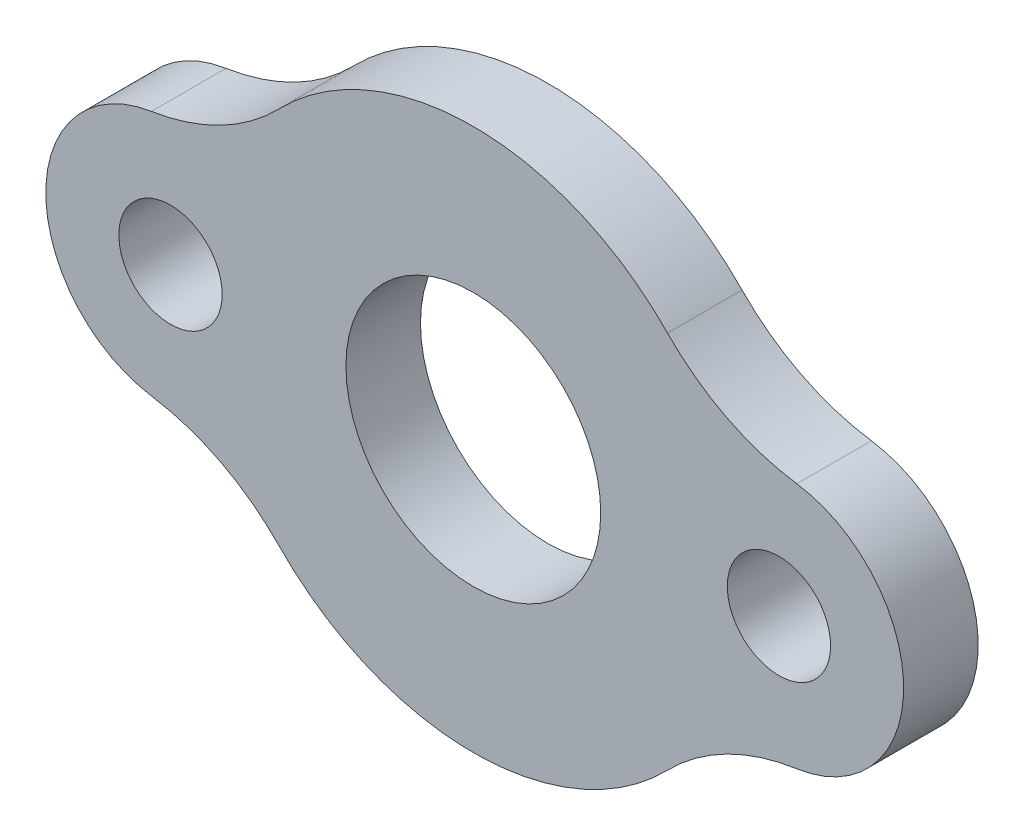
ISO-10303-21;
HEADER;
FILE_DESCRIPTION(('STEP AP214'),'2;1');
FILE_NAME('part.step','',(''),(''),'','','');
FILE_SCHEMA(('AUTOMOTIVE_DESIGN { 1 0 10303 214 1 1 1 1 }'));
ENDSEC;
DATA;
#1=APPLICATION_CONTEXT('core data for automotive mechanical design processes');
#2=APPLICATION_PROTOCOL_DEFINITION('international standard','automotive_design',2000,#1);
#3=PRODUCT_CONTEXT('',#1,'mechanical');
#4=PRODUCT('Part','Part','',(#3));
#5=PRODUCT_RELATED_PRODUCT_CATEGORY('part','',(#4));
#6=PRODUCT_DEFINITION_FORMATION('','',#4);
#7=PRODUCT_DEFINITION_CONTEXT('part definition',#1,'design');
#8=PRODUCT_DEFINITION('design','',#6,#7);
#9=PRODUCT_DEFINITION_SHAPE('','',#8);
#10=(LENGTH_UNIT() NAMED_UNIT(*) SI_UNIT(.MILLI.,.METRE.));
#11=(NAMED_UNIT(*) PLANE_ANGLE_UNIT() SI_UNIT($,.RADIAN.));
#12=(NAMED_UNIT(*) SI_UNIT($,.STERADIAN.) SOLID_ANGLE_UNIT());
#13=UNCERTAINTY_MEASURE_WITH_UNIT(LENGTH_MEASURE(1.E-05),#10,'distance_accuracy_value','');
#14=(GEOMETRIC_REPRESENTATION_CONTEXT(3) GLOBAL_UNCERTAINTY_ASSIGNED_CONTEXT((#13)) GLOBAL_UNIT_ASSIGNED_CONTEXT((#10,
#11,#12)) REPRESENTATION_CONTEXT('',''));
#15=CARTESIAN_POINT('',(0.,0.,0.));
#16=DIRECTION('',(0.,0.,1.));
#17=DIRECTION('',(1.,0.,0.));
#18=AXIS2_PLACEMENT_3D('',#15,#16,#17);
#19=CARTESIAN_POINT('',(3.93831321020069,-3.8392303330352,1.65));
#20=DIRECTION('',(0.,0.,1.));
#21=DIRECTION('',(1.,0.,0.));
#22=AXIS2_PLACEMENT_3D('',#19,#20,#21);
#23=PLANE('',#22);
#24=CARTESIAN_POINT('',(-6.69999985024333,0.,1.65));
#25=DIRECTION('',(0.,0.,1.));
#26=DIRECTION('',(1.,0.,0.));
#27=AXIS2_PLACEMENT_3D('',#24,#25,#26);
#28=CIRCLE('',#27,1.14300000000002);
#29=CARTESIAN_POINT('',(-5.55699985024331,0.,1.65));
#30=VERTEX_POINT('',#29);
#31=EDGE_CURVE('E186',#30,#30,#28,.T.);
#32=ORIENTED_EDGE('',*,*,#31,.F.);
#33=EDGE_LOOP('',(#32));
#34=FACE_BOUND('',#33,.T.);
#35=CARTESIAN_POINT('',(0.,0.,1.65));
#36=DIRECTION('',(0.,0.,1.));
#37=DIRECTION('',(1.,0.,0.));
#38=AXIS2_PLACEMENT_3D('',#35,#36,#37);
#39=CIRCLE('',#38,6.00000008940699);
#40=CARTESIAN_POINT('',(-4.30212440640869,-4.18231116306121,1.65));
#41=VERTEX_POINT('',#40);
#42=CARTESIAN_POINT('',(4.29634171295548,-4.18825130077008,1.65));
#43=VERTEX_POINT('',#42);
#44=EDGE_CURVE('E51',#41,#43,#39,.T.);
#45=ORIENTED_EDGE('',*,*,#44,.T.);
#46=CARTESIAN_POINT('',(7.87662642040138,-7.67846066607039,1.65));
#47=DIRECTION('',(0.,0.,-1.));
#48=DIRECTION('',(1.,0.,0.));
#49=AXIS2_PLACEMENT_3D('',#46,#47,#48);
#50=CIRCLE('',#49,5.00000000000009);
#51=CARTESIAN_POINT('',(7.1583412740768,-2.73032299129108,1.65));
#52=VERTEX_POINT('',#51);
#53=EDGE_CURVE('E180',#43,#52,#50,.T.);
#54=ORIENTED_EDGE('',*,*,#53,.T.);
#55=CARTESIAN_POINT('',(6.76200014975667,0.,1.65));
#56=DIRECTION('',(0.,0.,1.));
#57=DIRECTION('',(1.,0.,0.));
#58=AXIS2_PLACEMENT_3D('',#55,#56,#57);
#59=CIRCLE('',#58,2.75894000000001);
#60=CARTESIAN_POINT('',(7.1583412740768,2.73032299129108,1.65));
#61=VERTEX_POINT('',#60);
#62=EDGE_CURVE('E161',#52,#61,#59,.T.);
#63=ORIENTED_EDGE('',*,*,#62,.T.);
#64=CARTESIAN_POINT('',(7.87662642040138,7.67846066607039,1.65));
#65=DIRECTION('',(0.,0.,-1.));
#66=DIRECTION('',(1.,0.,0.));
#67=AXIS2_PLACEMENT_3D('',#64,#65,#66);
#68=CIRCLE('',#67,5.00000000000009);
#69=CARTESIAN_POINT('',(4.29634171295549,4.18825130077009,1.65));
#70=VERTEX_POINT('',#69);
#71=EDGE_CURVE('E176',#61,#70,#68,.T.);
#72=ORIENTED_EDGE('',*,*,#71,.T.);
#73=CARTESIAN_POINT('',(0.,0.,1.65));
#74=DIRECTION('',(0.,0.,1.));
#75=DIRECTION('',(1.,0.,0.));
#76=AXIS2_PLACEMENT_3D('',#73,#74,#75);
#77=CIRCLE('',#76,6.00000008940697);
#78=CARTESIAN_POINT('',(-4.30212440640868,4.1823111630612,1.65));
#79=VERTEX_POINT('',#78);
#80=EDGE_CURVE('E111',#70,#79,#77,.T.);
#81=ORIENTED_EDGE('',*,*,#80,.T.);
#82=CARTESIAN_POINT('',(-7.88722802499375,7.66757041367788,1.65));
#83=DIRECTION('',(0.,0.,-1.));
#84=DIRECTION('',(1.,0.,0.));
#85=AXIS2_PLACEMENT_3D('',#82,#83,#84);
#86=CIRCLE('',#85,5.0000000000001);
#87=CARTESIAN_POINT('',(-7.12215689048781,2.72645048403169,1.65));
#88=VERTEX_POINT('',#87);
#89=EDGE_CURVE('E105',#79,#88,#86,.T.);
#90=ORIENTED_EDGE('',*,*,#89,.T.);
#91=CARTESIAN_POINT('',(-6.69999985024333,0.,1.65));
#92=DIRECTION('',(0.,0.,1.));
#93=DIRECTION('',(1.,0.,0.));
#94=AXIS2_PLACEMENT_3D('',#91,#92,#93);
#95=CIRCLE('',#94,2.75893979791235);
#96=CARTESIAN_POINT('',(-7.12215689048781,-2.72645048403168,1.65));
#97=VERTEX_POINT('',#96);
#98=EDGE_CURVE('E109',#88,#97,#95,.T.);
#99=ORIENTED_EDGE('',*,*,#98,.T.);
#100=CARTESIAN_POINT('',(-7.88722802499378,-7.66757041367785,1.65));
#101=DIRECTION('',(0.,0.,-1.));
#102=DIRECTION('',(1.,0.,0.));
#103=AXIS2_PLACEMENT_3D('',#100,#101,#102);
#104=CIRCLE('',#103,5.00000000000009);
#105=EDGE_CURVE('E125',#97,#41,#104,.T.);
#106=ORIENTED_EDGE('',*,*,#105,.T.);
#107=EDGE_LOOP('',(#45,#54,#63,#72,#81,#90,#99,#106));
#108=FACE_BOUND('',#107,.T.);
#109=CARTESIAN_POINT('',(6.76200014975667,0.,1.65));
#110=DIRECTION('',(0.,0.,1.));
#111=DIRECTION('',(1.,0.,0.));
#112=AXIS2_PLACEMENT_3D('',#109,#110,#111);
#113=CIRCLE('',#112,1.14300000000002);
#114=CARTESIAN_POINT('',(7.90500014975669,0.,1.65));
#115=VERTEX_POINT('',#114);
#116=EDGE_CURVE('E134',#115,#115,#113,.T.);
#117=ORIENTED_EDGE('',*,*,#116,.F.);
#118=EDGE_LOOP('',(#117));
#119=FACE_BOUND('',#118,.T.);
#120=CARTESIAN_POINT('',(0.,0.,1.65));
#121=DIRECTION('',(0.,0.,1.));
#122=DIRECTION('',(1.,0.,0.));
#123=AXIS2_PLACEMENT_3D('',#120,#121,#122);
#124=CIRCLE('',#123,2.81921174677323);
#125=CARTESIAN_POINT('',(2.81921174677323,0.,1.65));
#126=VERTEX_POINT('',#125);
#127=EDGE_CURVE('E192',#126,#126,#124,.T.);
#128=ORIENTED_EDGE('',*,*,#127,.F.);
#129=EDGE_LOOP('',(#128));
#130=FACE_BOUND('',#129,.T.);
#131=ADVANCED_FACE('F34',(#34,#108,#119,#130),#23,.T.);
#132=CARTESIAN_POINT('',(3.93831321020069,-3.8392303330352,0.));
#133=DIRECTION('',(0.,0.,1.));
#134=DIRECTION('',(1.,0.,0.));
#135=AXIS2_PLACEMENT_3D('',#132,#133,#134);
#136=PLANE('',#135);
#137=CARTESIAN_POINT('',(-6.69999985024333,0.,0.));
#138=DIRECTION('',(0.,0.,1.));
#139=DIRECTION('',(1.,0.,0.));
#140=AXIS2_PLACEMENT_3D('',#137,#138,#139);
#141=CIRCLE('',#140,1.14300000000002);
#142=CARTESIAN_POINT('',(-5.55699985024331,0.,0.));
#143=VERTEX_POINT('',#142);
#144=EDGE_CURVE('E189',#143,#143,#141,.T.);
#145=ORIENTED_EDGE('',*,*,#144,.T.);
#146=EDGE_LOOP('',(#145));
#147=FACE_BOUND('',#146,.T.);
#148=CARTESIAN_POINT('',(7.87662642040138,-7.67846066607039,0.));
#149=DIRECTION('',(0.,0.,-1.));
#150=DIRECTION('',(1.,0.,0.));
#151=AXIS2_PLACEMENT_3D('',#148,#149,#150);
#152=CIRCLE('',#151,5.00000000000009);
#153=CARTESIAN_POINT('',(4.29634171295548,-4.18825130077008,0.));
#154=VERTEX_POINT('',#153);
#155=CARTESIAN_POINT('',(7.1583412740768,-2.73032299129108,0.));
#156=VERTEX_POINT('',#155);
#157=EDGE_CURVE('E131',#154,#156,#152,.T.);
#158=ORIENTED_EDGE('',*,*,#157,.F.);
#159=CARTESIAN_POINT('',(0.,0.,0.));
#160=DIRECTION('',(0.,0.,1.));
#161=DIRECTION('',(1.,0.,0.));
#162=AXIS2_PLACEMENT_3D('',#159,#160,#161);
#163=CIRCLE('',#162,6.00000008940697);
#164=CARTESIAN_POINT('',(-4.30212440640869,-4.18231116306121,0.));
#165=VERTEX_POINT('',#164);
#166=EDGE_CURVE('E144',#165,#154,#163,.T.);
#167=ORIENTED_EDGE('',*,*,#166,.F.);
#168=CARTESIAN_POINT('',(-7.88722802499378,-7.66757041367785,0.));
#169=DIRECTION('',(0.,0.,-1.));
#170=DIRECTION('',(1.,0.,0.));
#171=AXIS2_PLACEMENT_3D('',#168,#169,#170);
#172=CIRCLE('',#171,5.00000000000009);
#173=CARTESIAN_POINT('',(-7.12215689048781,-2.72645048403168,0.));
#174=VERTEX_POINT('',#173);
#175=EDGE_CURVE('E88',#174,#165,#172,.T.);
#176=ORIENTED_EDGE('',*,*,#175,.F.);
#177=CARTESIAN_POINT('',(-6.69999985024333,0.,0.));
#178=DIRECTION('',(0.,0.,1.));
#179=DIRECTION('',(1.,0.,0.));
#180=AXIS2_PLACEMENT_3D('',#177,#178,#179);
#181=CIRCLE('',#180,2.75893979791235);
#182=CARTESIAN_POINT('',(-7.12215689048781,2.72645048403169,0.));
#183=VERTEX_POINT('',#182);
#184=EDGE_CURVE('E81',#183,#174,#181,.T.);
#185=ORIENTED_EDGE('',*,*,#184,.F.);
#186=CARTESIAN_POINT('',(-7.88722802499375,7.66757041367788,0.));
#187=DIRECTION('',(0.,0.,-1.));
#188=DIRECTION('',(1.,0.,0.));
#189=AXIS2_PLACEMENT_3D('',#186,#187,#188);
#190=CIRCLE('',#189,5.0000000000001);
#191=CARTESIAN_POINT('',(-4.30212440640868,4.1823111630612,0.));
#192=VERTEX_POINT('',#191);
#193=EDGE_CURVE('E119',#192,#183,#190,.T.);
#194=ORIENTED_EDGE('',*,*,#193,.F.);
#195=CARTESIAN_POINT('',(0.,0.,0.));
#196=DIRECTION('',(0.,0.,1.));
#197=DIRECTION('',(1.,0.,0.));
#198=AXIS2_PLACEMENT_3D('',#195,#196,#197);
#199=CIRCLE('',#198,6.00000008940696);
#200=CARTESIAN_POINT('',(4.29634171295549,4.18825130077009,0.));
#201=VERTEX_POINT('',#200);
#202=EDGE_CURVE('E139',#201,#192,#199,.T.);
#203=ORIENTED_EDGE('',*,*,#202,.F.);
#204=CARTESIAN_POINT('',(7.87662642040138,7.67846066607039,0.));
#205=DIRECTION('',(0.,0.,-1.));
#206=DIRECTION('',(1.,0.,0.));
#207=AXIS2_PLACEMENT_3D('',#204,#205,#206);
#208=CIRCLE('',#207,5.00000000000009);
#209=CARTESIAN_POINT('',(7.1583412740768,2.73032299129108,0.));
#210=VERTEX_POINT('',#209);
#211=EDGE_CURVE('E136',#210,#201,#208,.T.);
#212=ORIENTED_EDGE('',*,*,#211,.F.);
#213=CARTESIAN_POINT('',(6.76200014975667,0.,0.));
#214=DIRECTION('',(0.,0.,1.));
#215=DIRECTION('',(1.,0.,0.));
#216=AXIS2_PLACEMENT_3D('',#213,#214,#215);
#217=CIRCLE('',#216,2.75894000000001);
#218=EDGE_CURVE('E133',#156,#210,#217,.T.);
#219=ORIENTED_EDGE('',*,*,#218,.F.);
#220=EDGE_LOOP('',(#158,#167,#176,#185,#194,#203,#212,#219));
#221=FACE_BOUND('',#220,.T.);
#222=CARTESIAN_POINT('',(6.76200014975667,0.,0.));
#223=DIRECTION('',(0.,0.,1.));
#224=DIRECTION('',(1.,0.,0.));
#225=AXIS2_PLACEMENT_3D('',#222,#223,#224);
#226=CIRCLE('',#225,1.14300000000002);
#227=CARTESIAN_POINT('',(7.90500014975669,0.,0.));
#228=VERTEX_POINT('',#227);
#229=EDGE_CURVE('E183',#228,#228,#226,.T.);
#230=ORIENTED_EDGE('',*,*,#229,.T.);
#231=EDGE_LOOP('',(#230));
#232=FACE_BOUND('',#231,.T.);
#233=CARTESIAN_POINT('',(0.,0.,0.));
#234=DIRECTION('',(0.,0.,1.));
#235=DIRECTION('',(1.,0.,0.));
#236=AXIS2_PLACEMENT_3D('',#233,#234,#235);
#237=CIRCLE('',#236,2.81921174677323);
#238=CARTESIAN_POINT('',(2.81921174677323,0.,0.));
#239=VERTEX_POINT('',#238);
#240=EDGE_CURVE('E195',#239,#239,#237,.T.);
#241=ORIENTED_EDGE('',*,*,#240,.T.);
#242=EDGE_LOOP('',(#241));
#243=FACE_BOUND('',#242,.T.);
#244=ADVANCED_FACE('F167',(#147,#221,#232,#243),#136,.F.);
#245=CARTESIAN_POINT('',(7.87662642040138,-7.67846066607039,1.65));
#246=DIRECTION('',(0.,0.,-1.));
#247=DIRECTION('',(-1.,0.,0.));
#248=AXIS2_PLACEMENT_3D('',#245,#246,#247);
#249=CYLINDRICAL_SURFACE('',#248,5.00000000000009);
#250=ORIENTED_EDGE('',*,*,#157,.T.);
#251=DIRECTION('',(0.,0.,-1.));
#252=VECTOR('',#251,1.);
#253=CARTESIAN_POINT('',(7.1583412740768,-2.73032299129108,1.65));
#254=LINE('',#253,#252);
#255=EDGE_CURVE('E43',#52,#156,#254,.T.);
#256=ORIENTED_EDGE('',*,*,#255,.F.);
#257=ORIENTED_EDGE('',*,*,#53,.F.);
#258=DIRECTION('',(0.,0.,-1.));
#259=VECTOR('',#258,1.);
#260=CARTESIAN_POINT('',(4.29634171295548,-4.18825130077008,1.65));
#261=LINE('',#260,#259);
#262=EDGE_CURVE('E11',#43,#154,#261,.T.);
#263=ORIENTED_EDGE('',*,*,#262,.T.);
#264=EDGE_LOOP('',(#250,#256,#257,#263));
#265=FACE_BOUND('',#264,.T.);
#266=ADVANCED_FACE('F36',(#265),#249,.F.);
#267=CARTESIAN_POINT('',(6.76200014975667,0.,1.65));
#268=DIRECTION('',(0.,0.,-1.));
#269=DIRECTION('',(-1.,0.,0.));
#270=AXIS2_PLACEMENT_3D('',#267,#268,#269);
#271=CYLINDRICAL_SURFACE('',#270,2.75894000000001);
#272=ORIENTED_EDGE('',*,*,#218,.T.);
#273=DIRECTION('',(0.,0.,-1.));
#274=VECTOR('',#273,1.);
#275=CARTESIAN_POINT('',(7.1583412740768,2.73032299129108,1.65));
#276=LINE('',#275,#274);
#277=EDGE_CURVE('E152',#61,#210,#276,.T.);
#278=ORIENTED_EDGE('',*,*,#277,.F.);
#279=ORIENTED_EDGE('',*,*,#62,.F.);
#280=ORIENTED_EDGE('',*,*,#255,.T.);
#281=EDGE_LOOP('',(#272,#278,#279,#280));
#282=FACE_BOUND('',#281,.T.);
#283=ADVANCED_FACE('F159',(#282),#271,.T.);
#284=CARTESIAN_POINT('',(7.87662642040138,7.67846066607039,1.65));
#285=DIRECTION('',(0.,0.,-1.));
#286=DIRECTION('',(-1.,0.,0.));
#287=AXIS2_PLACEMENT_3D('',#284,#285,#286);
#288=CYLINDRICAL_SURFACE('',#287,5.00000000000009);
#289=ORIENTED_EDGE('',*,*,#211,.T.);
#290=DIRECTION('',(0.,0.,-1.));
#291=VECTOR('',#290,1.);
#292=CARTESIAN_POINT('',(4.29634171295549,4.18825130077009,1.65));
#293=LINE('',#292,#291);
#294=EDGE_CURVE('E149',#70,#201,#293,.T.);
#295=ORIENTED_EDGE('',*,*,#294,.F.);
#296=ORIENTED_EDGE('',*,*,#71,.F.);
#297=ORIENTED_EDGE('',*,*,#277,.T.);
#298=EDGE_LOOP('',(#289,#295,#296,#297));
#299=FACE_BOUND('',#298,.T.);
#300=ADVANCED_FACE('F172',(#299),#288,.F.);
#301=CARTESIAN_POINT('',(0.,0.,1.65));
#302=DIRECTION('',(0.,0.,-1.));
#303=DIRECTION('',(-1.,0.,0.));
#304=AXIS2_PLACEMENT_3D('',#301,#302,#303);
#305=CYLINDRICAL_SURFACE('',#304,6.00000008940696);
#306=ORIENTED_EDGE('',*,*,#202,.T.);
#307=DIRECTION('',(0.,0.,-1.));
#308=VECTOR('',#307,1.);
#309=CARTESIAN_POINT('',(-4.30212440640868,4.1823111630612,1.65));
#310=LINE('',#309,#308);
#311=EDGE_CURVE('E120',#79,#192,#310,.T.);
#312=ORIENTED_EDGE('',*,*,#311,.F.);
#313=ORIENTED_EDGE('',*,*,#80,.F.);
#314=ORIENTED_EDGE('',*,*,#294,.T.);
#315=EDGE_LOOP('',(#306,#312,#313,#314));
#316=FACE_BOUND('',#315,.T.);
#317=ADVANCED_FACE('F175',(#316),#305,.T.);
#318=CARTESIAN_POINT('',(-7.88722802499375,7.66757041367788,1.65));
#319=DIRECTION('',(0.,0.,-1.));
#320=DIRECTION('',(-1.,0.,0.));
#321=AXIS2_PLACEMENT_3D('',#318,#319,#320);
#322=CYLINDRICAL_SURFACE('',#321,5.0000000000001);
#323=ORIENTED_EDGE('',*,*,#193,.T.);
#324=DIRECTION('',(0.,0.,-1.));
#325=VECTOR('',#324,1.);
#326=CARTESIAN_POINT('',(-7.12215689048781,2.72645048403169,1.65));
#327=LINE('',#326,#325);
#328=EDGE_CURVE('E116',#88,#183,#327,.T.);
#329=ORIENTED_EDGE('',*,*,#328,.F.);
#330=ORIENTED_EDGE('',*,*,#89,.F.);
#331=ORIENTED_EDGE('',*,*,#311,.T.);
#332=EDGE_LOOP('',(#323,#329,#330,#331));
#333=FACE_BOUND('',#332,.T.);
#334=ADVANCED_FACE('F117',(#333),#322,.F.);
#335=CARTESIAN_POINT('',(-6.69999985024333,0.,1.65));
#336=DIRECTION('',(0.,0.,-1.));
#337=DIRECTION('',(-1.,0.,0.));
#338=AXIS2_PLACEMENT_3D('',#335,#336,#337);
#339=CYLINDRICAL_SURFACE('',#338,2.75893979791235);
#340=ORIENTED_EDGE('',*,*,#184,.T.);
#341=DIRECTION('',(0.,0.,-1.));
#342=VECTOR('',#341,1.);
#343=CARTESIAN_POINT('',(-7.12215689048781,-2.72645048403168,1.65));
#344=LINE('',#343,#342);
#345=EDGE_CURVE('E121',#97,#174,#344,.T.);
#346=ORIENTED_EDGE('',*,*,#345,.F.);
#347=ORIENTED_EDGE('',*,*,#98,.F.);
#348=ORIENTED_EDGE('',*,*,#328,.T.);
#349=EDGE_LOOP('',(#340,#346,#347,#348));
#350=FACE_BOUND('',#349,.T.);
#351=ADVANCED_FACE('F123',(#350),#339,.T.);
#352=CARTESIAN_POINT('',(-7.88722802499378,-7.66757041367785,1.65));
#353=DIRECTION('',(0.,0.,-1.));
#354=DIRECTION('',(-1.,0.,0.));
#355=AXIS2_PLACEMENT_3D('',#352,#353,#354);
#356=CYLINDRICAL_SURFACE('',#355,5.00000000000009);
#357=ORIENTED_EDGE('',*,*,#175,.T.);
#358=DIRECTION('',(0.,0.,-1.));
#359=VECTOR('',#358,1.);
#360=CARTESIAN_POINT('',(-4.30212440640869,-4.18231116306121,1.65));
#361=LINE('',#360,#359);
#362=EDGE_CURVE('E127',#41,#165,#361,.T.);
#363=ORIENTED_EDGE('',*,*,#362,.F.);
#364=ORIENTED_EDGE('',*,*,#105,.F.);
#365=ORIENTED_EDGE('',*,*,#345,.T.);
#366=EDGE_LOOP('',(#357,#363,#364,#365));
#367=FACE_BOUND('',#366,.T.);
#368=ADVANCED_FACE('F220',(#367),#356,.F.);
#369=CARTESIAN_POINT('',(0.,0.,1.65));
#370=DIRECTION('',(0.,0.,-1.));
#371=DIRECTION('',(-1.,0.,0.));
#372=AXIS2_PLACEMENT_3D('',#369,#370,#371);
#373=CYLINDRICAL_SURFACE('',#372,6.00000008940697);
#374=ORIENTED_EDGE('',*,*,#166,.T.);
#375=ORIENTED_EDGE('',*,*,#262,.F.);
#376=ORIENTED_EDGE('',*,*,#44,.F.);
#377=ORIENTED_EDGE('',*,*,#362,.T.);
#378=EDGE_LOOP('',(#374,#375,#376,#377));
#379=FACE_BOUND('',#378,.T.);
#380=ADVANCED_FACE('F217',(#379),#373,.T.);
#381=CARTESIAN_POINT('',(6.76200014975667,0.,1.65));
#382=DIRECTION('',(0.,0.,-1.));
#383=DIRECTION('',(-1.,0.,0.));
#384=AXIS2_PLACEMENT_3D('',#381,#382,#383);
#385=CYLINDRICAL_SURFACE('',#384,1.14300000000002);
#386=ORIENTED_EDGE('',*,*,#116,.T.);
#387=EDGE_LOOP('',(#386));
#388=FACE_BOUND('',#387,.T.);
#389=ORIENTED_EDGE('',*,*,#229,.F.);
#390=EDGE_LOOP('',(#389));
#391=FACE_BOUND('',#390,.T.);
#392=ADVANCED_FACE('F214',(#388,#391),#385,.F.);
#393=CARTESIAN_POINT('',(-6.69999985024333,0.,1.65));
#394=DIRECTION('',(0.,0.,-1.));
#395=DIRECTION('',(-1.,0.,0.));
#396=AXIS2_PLACEMENT_3D('',#393,#394,#395);
#397=CYLINDRICAL_SURFACE('',#396,1.14300000000002);
#398=ORIENTED_EDGE('',*,*,#31,.T.);
#399=EDGE_LOOP('',(#398));
#400=FACE_BOUND('',#399,.T.);
#401=ORIENTED_EDGE('',*,*,#144,.F.);
#402=EDGE_LOOP('',(#401));
#403=FACE_BOUND('',#402,.T.);
#404=ADVANCED_FACE('F302',(#400,#403),#397,.F.);
#405=CARTESIAN_POINT('',(0.,0.,1.65));
#406=DIRECTION('',(0.,0.,-1.));
#407=DIRECTION('',(-1.,0.,0.));
#408=AXIS2_PLACEMENT_3D('',#405,#406,#407);
#409=CYLINDRICAL_SURFACE('',#408,2.81921174677323);
#410=ORIENTED_EDGE('',*,*,#127,.T.);
#411=EDGE_LOOP('',(#410));
#412=FACE_BOUND('',#411,.T.);
#413=ORIENTED_EDGE('',*,*,#240,.F.);
#414=EDGE_LOOP('',(#413));
#415=FACE_BOUND('',#414,.T.);
#416=ADVANCED_FACE('F201',(#412,#415),#409,.F.);
#417=CLOSED_SHELL('',(#131,#244,#266,#283,#300,#317,#334,#351,#368,#380,#392,#404,#416));
#418=MANIFOLD_SOLID_BREP('B2',#417);
#419=ADVANCED_BREP_SHAPE_REPRESENTATION('',(#18,#418),#14);
#420=SHAPE_DEFINITION_REPRESENTATION(#9,#419);
ENDSEC;
END-ISO-10303-21;
